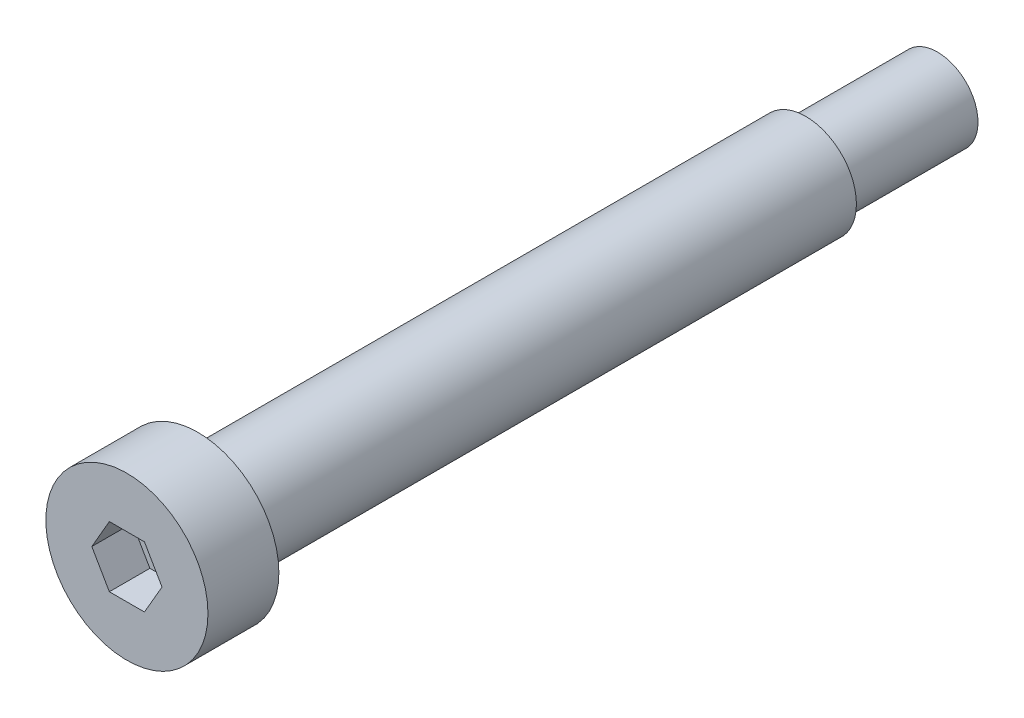
ISO-10303-21;
HEADER;
FILE_DESCRIPTION(('STEP AP214'),'2;1');
FILE_NAME('part.step','',(''),(''),'','','');
FILE_SCHEMA(('AUTOMOTIVE_DESIGN { 1 0 10303 214 1 1 1 1 }'));
ENDSEC;
DATA;
#1=APPLICATION_CONTEXT('core data for automotive mechanical design processes');
#2=APPLICATION_PROTOCOL_DEFINITION('international standard','automotive_design',2000,#1);
#3=PRODUCT_CONTEXT('',#1,'mechanical');
#4=PRODUCT('Part','Part','',(#3));
#5=PRODUCT_RELATED_PRODUCT_CATEGORY('part','',(#4));
#6=PRODUCT_DEFINITION_FORMATION('','',#4);
#7=PRODUCT_DEFINITION_CONTEXT('part definition',#1,'design');
#8=PRODUCT_DEFINITION('design','',#6,#7);
#9=PRODUCT_DEFINITION_SHAPE('','',#8);
#10=(LENGTH_UNIT() NAMED_UNIT(*) SI_UNIT(.MILLI.,.METRE.));
#11=(NAMED_UNIT(*) PLANE_ANGLE_UNIT() SI_UNIT($,.RADIAN.));
#12=(NAMED_UNIT(*) SI_UNIT($,.STERADIAN.) SOLID_ANGLE_UNIT());
#13=UNCERTAINTY_MEASURE_WITH_UNIT(LENGTH_MEASURE(1.E-05),#10,'distance_accuracy_value','');
#14=(GEOMETRIC_REPRESENTATION_CONTEXT(3) GLOBAL_UNCERTAINTY_ASSIGNED_CONTEXT((#13)) GLOBAL_UNIT_ASSIGNED_CONTEXT((#10,
#11,#12)) REPRESENTATION_CONTEXT('',''));
#15=CARTESIAN_POINT('',(0.,0.,0.));
#16=DIRECTION('',(0.,0.,1.));
#17=DIRECTION('',(1.,0.,0.));
#18=AXIS2_PLACEMENT_3D('',#15,#16,#17);
#19=CARTESIAN_POINT('',(0.,0.,40.));
#20=DIRECTION('',(0.,0.,1.));
#21=DIRECTION('',(1.,0.,0.));
#22=AXIS2_PLACEMENT_3D('',#19,#20,#21);
#23=PLANE('',#22);
#24=CARTESIAN_POINT('',(0.,0.,40.));
#25=DIRECTION('',(0.,0.,1.));
#26=DIRECTION('',(1.,0.,0.));
#27=AXIS2_PLACEMENT_3D('',#24,#25,#26);
#28=CIRCLE('',#27,4.);
#29=CARTESIAN_POINT('',(4.,0.,40.));
#30=VERTEX_POINT('',#29);
#31=EDGE_CURVE('E148',#30,#30,#28,.T.);
#32=ORIENTED_EDGE('',*,*,#31,.T.);
#33=EDGE_LOOP('',(#32));
#34=FACE_BOUND('',#33,.T.);
#35=DIRECTION('',(-0.5,0.866025403784439,0.));
#36=VECTOR('',#35,1.);
#37=CARTESIAN_POINT('',(1.73205080756888,0.,40.));
#38=LINE('',#37,#36);
#39=CARTESIAN_POINT('',(1.73205080756888,0.,40.));
#40=VERTEX_POINT('',#39);
#41=CARTESIAN_POINT('',(0.866025403784439,1.5,40.));
#42=VERTEX_POINT('',#41);
#43=EDGE_CURVE('E114',#40,#42,#38,.T.);
#44=ORIENTED_EDGE('',*,*,#43,.F.);
#45=DIRECTION('',(0.5,0.866025403784439,0.));
#46=VECTOR('',#45,1.);
#47=CARTESIAN_POINT('',(0.866025403784437,-1.5,40.));
#48=LINE('',#47,#46);
#49=CARTESIAN_POINT('',(0.866025403784437,-1.5,40.));
#50=VERTEX_POINT('',#49);
#51=EDGE_CURVE('E93',#50,#40,#48,.T.);
#52=ORIENTED_EDGE('',*,*,#51,.F.);
#53=DIRECTION('',(1.,0.,0.));
#54=VECTOR('',#53,1.);
#55=CARTESIAN_POINT('',(-0.866025403784439,-1.5,40.));
#56=LINE('',#55,#54);
#57=CARTESIAN_POINT('',(-0.866025403784439,-1.5,40.));
#58=VERTEX_POINT('',#57);
#59=EDGE_CURVE('E60',#58,#50,#56,.T.);
#60=ORIENTED_EDGE('',*,*,#59,.F.);
#61=DIRECTION('',(0.5,-0.866025403784439,0.));
#62=VECTOR('',#61,1.);
#63=CARTESIAN_POINT('',(-1.73205080756888,0.,40.));
#64=LINE('',#63,#62);
#65=CARTESIAN_POINT('',(-1.73205080756888,0.,40.));
#66=VERTEX_POINT('',#65);
#67=EDGE_CURVE('E124',#66,#58,#64,.T.);
#68=ORIENTED_EDGE('',*,*,#67,.F.);
#69=DIRECTION('',(-0.5,-0.866025403784439,0.));
#70=VECTOR('',#69,1.);
#71=CARTESIAN_POINT('',(-0.866025403784438,1.5,40.));
#72=LINE('',#71,#70);
#73=CARTESIAN_POINT('',(-0.866025403784438,1.5,40.));
#74=VERTEX_POINT('',#73);
#75=EDGE_CURVE('E113',#74,#66,#72,.T.);
#76=ORIENTED_EDGE('',*,*,#75,.F.);
#77=DIRECTION('',(-1.,0.,0.));
#78=VECTOR('',#77,1.);
#79=CARTESIAN_POINT('',(0.866025403784439,1.5,40.));
#80=LINE('',#79,#78);
#81=EDGE_CURVE('E102',#42,#74,#80,.T.);
#82=ORIENTED_EDGE('',*,*,#81,.F.);
#83=EDGE_LOOP('',(#44,#52,#60,#68,#76,#82));
#84=FACE_BOUND('',#83,.T.);
#85=ADVANCED_FACE('F39',(#34,#84),#23,.T.);
#86=CARTESIAN_POINT('',(0.,0.,6.5));
#87=DIRECTION('',(0.,0.,-1.));
#88=DIRECTION('',(-1.,0.,0.));
#89=AXIS2_PLACEMENT_3D('',#86,#87,#88);
#90=CYLINDRICAL_SURFACE('',#89,2.);
#91=CARTESIAN_POINT('',(0.,0.,6.5));
#92=DIRECTION('',(0.,0.,1.));
#93=DIRECTION('',(1.,0.,0.));
#94=AXIS2_PLACEMENT_3D('',#91,#92,#93);
#95=CIRCLE('',#94,2.);
#96=CARTESIAN_POINT('',(2.,0.,6.5));
#97=VERTEX_POINT('',#96);
#98=EDGE_CURVE('E11',#97,#97,#95,.T.);
#99=ORIENTED_EDGE('',*,*,#98,.F.);
#100=EDGE_LOOP('',(#99));
#101=FACE_BOUND('',#100,.T.);
#102=CARTESIAN_POINT('',(0.,0.,0.));
#103=DIRECTION('',(0.,0.,1.));
#104=DIRECTION('',(1.,0.,0.));
#105=AXIS2_PLACEMENT_3D('',#102,#103,#104);
#106=CIRCLE('',#105,2.);
#107=CARTESIAN_POINT('',(2.,0.,0.));
#108=VERTEX_POINT('',#107);
#109=EDGE_CURVE('E43',#108,#108,#106,.T.);
#110=ORIENTED_EDGE('',*,*,#109,.T.);
#111=EDGE_LOOP('',(#110));
#112=FACE_BOUND('',#111,.T.);
#113=ADVANCED_FACE('F41',(#101,#112),#90,.T.);
#114=CARTESIAN_POINT('',(0.,0.,0.));
#115=DIRECTION('',(0.,0.,1.));
#116=DIRECTION('',(1.,0.,0.));
#117=AXIS2_PLACEMENT_3D('',#114,#115,#116);
#118=PLANE('',#117);
#119=ORIENTED_EDGE('',*,*,#109,.F.);
#120=EDGE_LOOP('',(#119));
#121=FACE_BOUND('',#120,.T.);
#122=ADVANCED_FACE('F174',(#121),#118,.F.);
#123=CARTESIAN_POINT('',(0.,0.,36.5));
#124=DIRECTION('',(0.,0.,-1.));
#125=DIRECTION('',(-1.,0.,0.));
#126=AXIS2_PLACEMENT_3D('',#123,#124,#125);
#127=CYLINDRICAL_SURFACE('',#126,2.5);
#128=CARTESIAN_POINT('',(0.,0.,36.5));
#129=DIRECTION('',(0.,0.,1.));
#130=DIRECTION('',(1.,0.,0.));
#131=AXIS2_PLACEMENT_3D('',#128,#129,#130);
#132=CIRCLE('',#131,2.5);
#133=CARTESIAN_POINT('',(2.5,0.,36.5));
#134=VERTEX_POINT('',#133);
#135=EDGE_CURVE('E154',#134,#134,#132,.T.);
#136=ORIENTED_EDGE('',*,*,#135,.F.);
#137=EDGE_LOOP('',(#136));
#138=FACE_BOUND('',#137,.T.);
#139=CARTESIAN_POINT('',(0.,0.,6.5));
#140=DIRECTION('',(0.,0.,1.));
#141=DIRECTION('',(1.,0.,0.));
#142=AXIS2_PLACEMENT_3D('',#139,#140,#141);
#143=CIRCLE('',#142,2.5);
#144=CARTESIAN_POINT('',(2.5,0.,6.5));
#145=VERTEX_POINT('',#144);
#146=EDGE_CURVE('E151',#145,#145,#143,.T.);
#147=ORIENTED_EDGE('',*,*,#146,.T.);
#148=EDGE_LOOP('',(#147));
#149=FACE_BOUND('',#148,.T.);
#150=ADVANCED_FACE('F160',(#138,#149),#127,.T.);
#151=CARTESIAN_POINT('',(0.,0.,6.5));
#152=DIRECTION('',(0.,0.,1.));
#153=DIRECTION('',(1.,0.,0.));
#154=AXIS2_PLACEMENT_3D('',#151,#152,#153);
#155=PLANE('',#154);
#156=ORIENTED_EDGE('',*,*,#98,.T.);
#157=EDGE_LOOP('',(#156));
#158=FACE_BOUND('',#157,.T.);
#159=ORIENTED_EDGE('',*,*,#146,.F.);
#160=EDGE_LOOP('',(#159));
#161=FACE_BOUND('',#160,.T.);
#162=ADVANCED_FACE('F162',(#158,#161),#155,.F.);
#163=CARTESIAN_POINT('',(0.,0.,40.));
#164=DIRECTION('',(0.,0.,-1.));
#165=DIRECTION('',(-1.,0.,0.));
#166=AXIS2_PLACEMENT_3D('',#163,#164,#165);
#167=CYLINDRICAL_SURFACE('',#166,4.);
#168=ORIENTED_EDGE('',*,*,#31,.F.);
#169=EDGE_LOOP('',(#168));
#170=FACE_BOUND('',#169,.T.);
#171=CARTESIAN_POINT('',(0.,0.,36.5));
#172=DIRECTION('',(0.,0.,1.));
#173=DIRECTION('',(1.,0.,0.));
#174=AXIS2_PLACEMENT_3D('',#171,#172,#173);
#175=CIRCLE('',#174,4.);
#176=CARTESIAN_POINT('',(4.,0.,36.5));
#177=VERTEX_POINT('',#176);
#178=EDGE_CURVE('E147',#177,#177,#175,.T.);
#179=ORIENTED_EDGE('',*,*,#178,.T.);
#180=EDGE_LOOP('',(#179));
#181=FACE_BOUND('',#180,.T.);
#182=ADVANCED_FACE('F164',(#170,#181),#167,.T.);
#183=CARTESIAN_POINT('',(0.,0.,36.5));
#184=DIRECTION('',(0.,0.,1.));
#185=DIRECTION('',(1.,0.,0.));
#186=AXIS2_PLACEMENT_3D('',#183,#184,#185);
#187=PLANE('',#186);
#188=ORIENTED_EDGE('',*,*,#135,.T.);
#189=EDGE_LOOP('',(#188));
#190=FACE_BOUND('',#189,.T.);
#191=ORIENTED_EDGE('',*,*,#178,.F.);
#192=EDGE_LOOP('',(#191));
#193=FACE_BOUND('',#192,.T.);
#194=ADVANCED_FACE('F171',(#190,#193),#187,.F.);
#195=CARTESIAN_POINT('',(0.866025403784437,-1.5,40.));
#196=DIRECTION('',(-0.866025403784439,0.5,0.));
#197=DIRECTION('',(-0.5,-0.866025403784439,0.));
#198=AXIS2_PLACEMENT_3D('',#195,#196,#197);
#199=PLANE('',#198);
#200=DIRECTION('',(0.5,0.866025403784439,0.));
#201=VECTOR('',#200,1.);
#202=CARTESIAN_POINT('',(0.866025403784437,-1.5,38.));
#203=LINE('',#202,#201);
#204=CARTESIAN_POINT('',(0.866025403784437,-1.5,38.));
#205=VERTEX_POINT('',#204);
#206=CARTESIAN_POINT('',(1.73205080756888,0.,38.));
#207=VERTEX_POINT('',#206);
#208=EDGE_CURVE('E131',#205,#207,#203,.T.);
#209=ORIENTED_EDGE('',*,*,#208,.F.);
#210=DIRECTION('',(0.,0.,-1.));
#211=VECTOR('',#210,1.);
#212=CARTESIAN_POINT('',(0.866025403784437,-1.5,40.));
#213=LINE('',#212,#211);
#214=EDGE_CURVE('E130',#50,#205,#213,.T.);
#215=ORIENTED_EDGE('',*,*,#214,.F.);
#216=ORIENTED_EDGE('',*,*,#51,.T.);
#217=DIRECTION('',(0.,0.,-1.));
#218=VECTOR('',#217,1.);
#219=CARTESIAN_POINT('',(1.73205080756888,0.,40.));
#220=LINE('',#219,#218);
#221=EDGE_CURVE('E145',#40,#207,#220,.T.);
#222=ORIENTED_EDGE('',*,*,#221,.T.);
#223=EDGE_LOOP('',(#209,#215,#216,#222));
#224=FACE_BOUND('',#223,.T.);
#225=ADVANCED_FACE('F188',(#224),#199,.T.);
#226=CARTESIAN_POINT('',(1.73205080756888,0.,40.));
#227=DIRECTION('',(-0.866025403784439,-0.5,0.));
#228=DIRECTION('',(0.5,-0.866025403784439,0.));
#229=AXIS2_PLACEMENT_3D('',#226,#227,#228);
#230=PLANE('',#229);
#231=DIRECTION('',(-0.5,0.866025403784439,0.));
#232=VECTOR('',#231,1.);
#233=CARTESIAN_POINT('',(1.73205080756888,0.,38.));
#234=LINE('',#233,#232);
#235=CARTESIAN_POINT('',(0.866025403784439,1.5,38.));
#236=VERTEX_POINT('',#235);
#237=EDGE_CURVE('E133',#207,#236,#234,.T.);
#238=ORIENTED_EDGE('',*,*,#237,.F.);
#239=ORIENTED_EDGE('',*,*,#221,.F.);
#240=ORIENTED_EDGE('',*,*,#43,.T.);
#241=DIRECTION('',(0.,0.,-1.));
#242=VECTOR('',#241,1.);
#243=CARTESIAN_POINT('',(0.866025403784439,1.5,40.));
#244=LINE('',#243,#242);
#245=EDGE_CURVE('E109',#42,#236,#244,.T.);
#246=ORIENTED_EDGE('',*,*,#245,.T.);
#247=EDGE_LOOP('',(#238,#239,#240,#246));
#248=FACE_BOUND('',#247,.T.);
#249=ADVANCED_FACE('F193',(#248),#230,.T.);
#250=CARTESIAN_POINT('',(0.866025403784439,1.5,40.));
#251=DIRECTION('',(0.,-1.,0.));
#252=DIRECTION('',(1.,0.,0.));
#253=AXIS2_PLACEMENT_3D('',#250,#251,#252);
#254=PLANE('',#253);
#255=DIRECTION('',(-1.,0.,0.));
#256=VECTOR('',#255,1.);
#257=CARTESIAN_POINT('',(0.866025403784439,1.5,38.));
#258=LINE('',#257,#256);
#259=CARTESIAN_POINT('',(-0.866025403784438,1.5,38.));
#260=VERTEX_POINT('',#259);
#261=EDGE_CURVE('E135',#236,#260,#258,.T.);
#262=ORIENTED_EDGE('',*,*,#261,.F.);
#263=ORIENTED_EDGE('',*,*,#245,.F.);
#264=ORIENTED_EDGE('',*,*,#81,.T.);
#265=DIRECTION('',(0.,0.,-1.));
#266=VECTOR('',#265,1.);
#267=CARTESIAN_POINT('',(-0.866025403784438,1.5,40.));
#268=LINE('',#267,#266);
#269=EDGE_CURVE('E106',#74,#260,#268,.T.);
#270=ORIENTED_EDGE('',*,*,#269,.T.);
#271=EDGE_LOOP('',(#262,#263,#264,#270));
#272=FACE_BOUND('',#271,.T.);
#273=ADVANCED_FACE('F105',(#272),#254,.T.);
#274=CARTESIAN_POINT('',(-0.866025403784438,1.5,40.));
#275=DIRECTION('',(0.866025403784439,-0.5,0.));
#276=DIRECTION('',(0.5,0.866025403784439,0.));
#277=AXIS2_PLACEMENT_3D('',#274,#275,#276);
#278=PLANE('',#277);
#279=DIRECTION('',(-0.5,-0.866025403784439,0.));
#280=VECTOR('',#279,1.);
#281=CARTESIAN_POINT('',(-0.866025403784438,1.5,38.));
#282=LINE('',#281,#280);
#283=CARTESIAN_POINT('',(-1.73205080756888,0.,38.));
#284=VERTEX_POINT('',#283);
#285=EDGE_CURVE('E120',#260,#284,#282,.T.);
#286=ORIENTED_EDGE('',*,*,#285,.F.);
#287=ORIENTED_EDGE('',*,*,#269,.F.);
#288=ORIENTED_EDGE('',*,*,#75,.T.);
#289=DIRECTION('',(0.,0.,-1.));
#290=VECTOR('',#289,1.);
#291=CARTESIAN_POINT('',(-1.73205080756888,0.,40.));
#292=LINE('',#291,#290);
#293=EDGE_CURVE('E121',#66,#284,#292,.T.);
#294=ORIENTED_EDGE('',*,*,#293,.T.);
#295=EDGE_LOOP('',(#286,#287,#288,#294));
#296=FACE_BOUND('',#295,.T.);
#297=ADVANCED_FACE('F117',(#296),#278,.T.);
#298=CARTESIAN_POINT('',(-1.73205080756888,0.,40.));
#299=DIRECTION('',(0.866025403784439,0.5,0.));
#300=DIRECTION('',(-0.5,0.866025403784439,0.));
#301=AXIS2_PLACEMENT_3D('',#298,#299,#300);
#302=PLANE('',#301);
#303=DIRECTION('',(0.5,-0.866025403784439,0.));
#304=VECTOR('',#303,1.);
#305=CARTESIAN_POINT('',(-1.73205080756888,0.,38.));
#306=LINE('',#305,#304);
#307=CARTESIAN_POINT('',(-0.866025403784439,-1.5,38.));
#308=VERTEX_POINT('',#307);
#309=EDGE_CURVE('E138',#284,#308,#306,.T.);
#310=ORIENTED_EDGE('',*,*,#309,.F.);
#311=ORIENTED_EDGE('',*,*,#293,.F.);
#312=ORIENTED_EDGE('',*,*,#67,.T.);
#313=DIRECTION('',(0.,0.,-1.));
#314=VECTOR('',#313,1.);
#315=CARTESIAN_POINT('',(-0.866025403784439,-1.5,40.));
#316=LINE('',#315,#314);
#317=EDGE_CURVE('E54',#58,#308,#316,.T.);
#318=ORIENTED_EDGE('',*,*,#317,.T.);
#319=EDGE_LOOP('',(#310,#311,#312,#318));
#320=FACE_BOUND('',#319,.T.);
#321=ADVANCED_FACE('F207',(#320),#302,.T.);
#322=CARTESIAN_POINT('',(-0.866025403784439,-1.5,40.));
#323=DIRECTION('',(0.,1.,0.));
#324=DIRECTION('',(-1.,0.,0.));
#325=AXIS2_PLACEMENT_3D('',#322,#323,#324);
#326=PLANE('',#325);
#327=DIRECTION('',(1.,0.,0.));
#328=VECTOR('',#327,1.);
#329=CARTESIAN_POINT('',(-0.866025403784439,-1.5,38.));
#330=LINE('',#329,#328);
#331=EDGE_CURVE('E86',#308,#205,#330,.T.);
#332=ORIENTED_EDGE('',*,*,#331,.F.);
#333=ORIENTED_EDGE('',*,*,#317,.F.);
#334=ORIENTED_EDGE('',*,*,#59,.T.);
#335=ORIENTED_EDGE('',*,*,#214,.T.);
#336=EDGE_LOOP('',(#332,#333,#334,#335));
#337=FACE_BOUND('',#336,.T.);
#338=ADVANCED_FACE('F208',(#337),#326,.T.);
#339=CARTESIAN_POINT('',(0.,0.,38.));
#340=DIRECTION('',(0.,0.,1.));
#341=DIRECTION('',(1.,0.,0.));
#342=AXIS2_PLACEMENT_3D('',#339,#340,#341);
#343=PLANE('',#342);
#344=ORIENTED_EDGE('',*,*,#208,.T.);
#345=ORIENTED_EDGE('',*,*,#237,.T.);
#346=ORIENTED_EDGE('',*,*,#261,.T.);
#347=ORIENTED_EDGE('',*,*,#285,.T.);
#348=ORIENTED_EDGE('',*,*,#309,.T.);
#349=ORIENTED_EDGE('',*,*,#331,.T.);
#350=EDGE_LOOP('',(#344,#345,#346,#347,#348,#349));
#351=FACE_BOUND('',#350,.T.);
#352=ADVANCED_FACE('F203',(#351),#343,.T.);
#353=CLOSED_SHELL('',(#85,#113,#122,#150,#162,#182,#194,#225,#249,#273,#297,#321,#338,#352));
#354=MANIFOLD_SOLID_BREP('B2',#353);
#355=ADVANCED_BREP_SHAPE_REPRESENTATION('',(#18,#354),#14);
#356=SHAPE_DEFINITION_REPRESENTATION(#9,#355);
ENDSEC;
END-ISO-10303-21;
